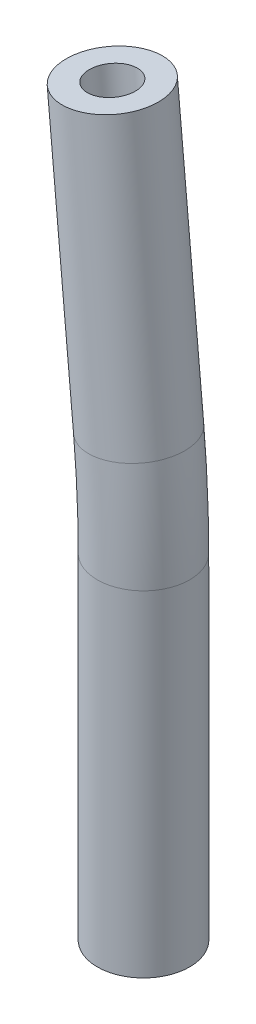
ISO-10303-21;
HEADER;
FILE_DESCRIPTION(('STEP AP214'),'2;1');
FILE_NAME('part.step','',(''),(''),'','','');
FILE_SCHEMA(('AUTOMOTIVE_DESIGN { 1 0 10303 214 1 1 1 1 }'));
ENDSEC;
DATA;
#1=APPLICATION_CONTEXT('core data for automotive mechanical design processes');
#2=APPLICATION_PROTOCOL_DEFINITION('international standard','automotive_design',2000,#1);
#3=PRODUCT_CONTEXT('',#1,'mechanical');
#4=PRODUCT('Part','Part','',(#3));
#5=PRODUCT_RELATED_PRODUCT_CATEGORY('part','',(#4));
#6=PRODUCT_DEFINITION_FORMATION('','',#4);
#7=PRODUCT_DEFINITION_CONTEXT('part definition',#1,'design');
#8=PRODUCT_DEFINITION('design','',#6,#7);
#9=PRODUCT_DEFINITION_SHAPE('','',#8);
#10=(LENGTH_UNIT() NAMED_UNIT(*) SI_UNIT(.MILLI.,.METRE.));
#11=(NAMED_UNIT(*) PLANE_ANGLE_UNIT() SI_UNIT($,.RADIAN.));
#12=(NAMED_UNIT(*) SI_UNIT($,.STERADIAN.) SOLID_ANGLE_UNIT());
#13=UNCERTAINTY_MEASURE_WITH_UNIT(LENGTH_MEASURE(1.E-05),#10,'distance_accuracy_value','');
#14=(GEOMETRIC_REPRESENTATION_CONTEXT(3) GLOBAL_UNCERTAINTY_ASSIGNED_CONTEXT((#13)) GLOBAL_UNIT_ASSIGNED_CONTEXT((#10,
#11,#12)) REPRESENTATION_CONTEXT('',''));
#15=CARTESIAN_POINT('',(0.,0.,0.));
#16=DIRECTION('',(0.,0.,1.));
#17=DIRECTION('',(1.,0.,0.));
#18=AXIS2_PLACEMENT_3D('',#15,#16,#17);
#19=CARTESIAN_POINT('',(0.0518681379725441,-16.7968670346591,0.));
#20=DIRECTION('',(0.,1.,0.));
#21=DIRECTION('',(-1.,0.,0.));
#22=AXIS2_PLACEMENT_3D('',#19,#20,#21);
#23=CYLINDRICAL_SURFACE('',#22,2.);
#24=CARTESIAN_POINT('',(0.0518681379725354,-2.27686703465905,0.));
#25=DIRECTION('',(0.,1.,0.));
#26=DIRECTION('',(0.,0.,1.));
#27=AXIS2_PLACEMENT_3D('',#24,#25,#26);
#28=CIRCLE('',#27,2.);
#29=CARTESIAN_POINT('',(2.05186813797254,-2.27686703465905,0.));
#30=VERTEX_POINT('',#29);
#31=EDGE_CURVE('E58',#30,#30,#28,.T.);
#32=ORIENTED_EDGE('',*,*,#31,.F.);
#33=EDGE_LOOP('',(#32));
#34=FACE_BOUND('',#33,.T.);
#35=CARTESIAN_POINT('',(0.0518681379725441,-16.7968670346591,0.));
#36=DIRECTION('',(0.,1.,0.));
#37=DIRECTION('',(0.,0.,1.));
#38=AXIS2_PLACEMENT_3D('',#35,#36,#37);
#39=CIRCLE('',#38,2.);
#40=CARTESIAN_POINT('',(0.0518681379725441,-16.7968670346591,2.));
#41=VERTEX_POINT('',#40);
#42=EDGE_CURVE('E56',#41,#41,#39,.T.);
#43=ORIENTED_EDGE('',*,*,#42,.T.);
#44=EDGE_LOOP('',(#43));
#45=FACE_BOUND('',#44,.T.);
#46=ADVANCED_FACE('F35',(#34,#45),#23,.T.);
#47=CARTESIAN_POINT('',(-49.9481318620275,-2.27686703465906,0.));
#48=DIRECTION('',(0.,0.,1.));
#49=DIRECTION('',(1.,0.,0.));
#50=AXIS2_PLACEMENT_3D('',#47,#48,#49);
#51=TOROIDAL_SURFACE('',#50,50.,2.);
#52=CARTESIAN_POINT('',(-0.15549680176815,2.27214316051908,0.));
#53=DIRECTION('',(-0.0909802039035622,0.995852701205186,0.));
#54=DIRECTION('',(0.,0.,1.));
#55=AXIS2_PLACEMENT_3D('',#52,#53,#54);
#56=CIRCLE('',#55,2.);
#57=CARTESIAN_POINT('',(1.83620860064224,2.45410356832621,0.));
#58=VERTEX_POINT('',#57);
#59=EDGE_CURVE('E39',#58,#58,#56,.T.);
#60=CARTESIAN_POINT('',(-49.9481318620275,-2.27686703465906,0.));
#61=DIRECTION('',(0.,0.,1.));
#62=DIRECTION('',(1.,0.,0.));
#63=AXIS2_PLACEMENT_3D('',#60,#61,#62);
#64=CIRCLE('',#63,52.);
#65=EDGE_CURVE('',#30,#58,#64,.T.);
#66=ORIENTED_EDGE('',*,*,#31,.T.);
#67=ORIENTED_EDGE('',*,*,#59,.F.);
#68=ORIENTED_EDGE('',*,*,#65,.T.);
#69=ORIENTED_EDGE('',*,*,#65,.F.);
#70=EDGE_LOOP('',(#66,#68,#67,#69));
#71=FACE_BOUND('',#70,.T.);
#72=ADVANCED_FACE('F66',(#71),#51,.T.);
#73=CARTESIAN_POINT('',(-0.155496801768149,2.27214316051909,0.));
#74=DIRECTION('',(-0.0909802039035626,0.995852701205186,0.));
#75=DIRECTION('',(-0.995852701205187,-0.0909802039035626,0.));
#76=AXIS2_PLACEMENT_3D('',#73,#74,#75);
#77=CYLINDRICAL_SURFACE('',#76,2.);
#78=CARTESIAN_POINT('',(-1.2982081627969,14.7800530876562,0.));
#79=DIRECTION('',(-0.090980203903562,0.995852701205186,0.));
#80=DIRECTION('',(0.,0.,1.));
#81=AXIS2_PLACEMENT_3D('',#78,#79,#80);
#82=CIRCLE('',#81,2.);
#83=CARTESIAN_POINT('',(-1.2982081627969,14.7800530876562,2.));
#84=VERTEX_POINT('',#83);
#85=EDGE_CURVE('E52',#84,#84,#82,.T.);
#86=ORIENTED_EDGE('',*,*,#85,.F.);
#87=EDGE_LOOP('',(#86));
#88=FACE_BOUND('',#87,.T.);
#89=ORIENTED_EDGE('',*,*,#59,.T.);
#90=EDGE_LOOP('',(#89));
#91=FACE_BOUND('',#90,.T.);
#92=ADVANCED_FACE('F37',(#88,#91),#77,.T.);
#93=CARTESIAN_POINT('',(0.0518681379725441,-16.7968670346591,0.));
#94=DIRECTION('',(0.,1.,0.));
#95=DIRECTION('',(0.,0.,1.));
#96=AXIS2_PLACEMENT_3D('',#93,#94,#95);
#97=PLANE('',#96);
#98=CARTESIAN_POINT('',(0.0518681379725441,-16.7968670346591,0.));
#99=DIRECTION('',(0.,1.,0.));
#100=DIRECTION('',(0.,0.,1.));
#101=AXIS2_PLACEMENT_3D('',#98,#99,#100);
#102=CIRCLE('',#101,1.);
#103=CARTESIAN_POINT('',(0.0518681379725441,-16.7968670346591,1.));
#104=VERTEX_POINT('',#103);
#105=EDGE_CURVE('E55',#104,#104,#102,.F.);
#106=ORIENTED_EDGE('',*,*,#105,.F.);
#107=EDGE_LOOP('',(#106));
#108=FACE_BOUND('',#107,.T.);
#109=ORIENTED_EDGE('',*,*,#42,.F.);
#110=EDGE_LOOP('',(#109));
#111=FACE_BOUND('',#110,.T.);
#112=ADVANCED_FACE('F72',(#108,#111),#97,.F.);
#113=CARTESIAN_POINT('',(-1.2982081627969,14.7800530876562,0.));
#114=DIRECTION('',(-0.090980203903562,0.995852701205186,0.));
#115=DIRECTION('',(0.,0.,1.));
#116=AXIS2_PLACEMENT_3D('',#113,#114,#115);
#117=PLANE('',#116);
#118=CARTESIAN_POINT('',(-1.2982081627969,14.7800530876562,0.));
#119=DIRECTION('',(-0.090980203903562,0.995852701205186,0.));
#120=DIRECTION('',(0.,0.,1.));
#121=AXIS2_PLACEMENT_3D('',#118,#119,#120);
#122=CIRCLE('',#121,1.);
#123=CARTESIAN_POINT('',(-1.2982081627969,14.7800530876562,1.));
#124=VERTEX_POINT('',#123);
#125=EDGE_CURVE('E10',#124,#124,#122,.F.);
#126=ORIENTED_EDGE('',*,*,#125,.T.);
#127=EDGE_LOOP('',(#126));
#128=FACE_BOUND('',#127,.T.);
#129=ORIENTED_EDGE('',*,*,#85,.T.);
#130=EDGE_LOOP('',(#129));
#131=FACE_BOUND('',#130,.T.);
#132=ADVANCED_FACE('F90',(#128,#131),#117,.T.);
#133=CARTESIAN_POINT('',(0.0518681379725441,-16.7968670346591,0.));
#134=DIRECTION('',(0.,1.,0.));
#135=DIRECTION('',(-1.,0.,0.));
#136=AXIS2_PLACEMENT_3D('',#133,#134,#135);
#137=CYLINDRICAL_SURFACE('',#136,1.);
#138=CARTESIAN_POINT('',(0.0518681379725354,-2.27686703465905,0.));
#139=DIRECTION('',(0.,1.,0.));
#140=DIRECTION('',(0.,0.,1.));
#141=AXIS2_PLACEMENT_3D('',#138,#139,#140);
#142=CIRCLE('',#141,1.);
#143=CARTESIAN_POINT('',(1.05186813797254,-2.27686703465905,0.));
#144=VERTEX_POINT('',#143);
#145=EDGE_CURVE('E48',#144,#144,#142,.F.);
#146=ORIENTED_EDGE('',*,*,#145,.F.);
#147=EDGE_LOOP('',(#146));
#148=FACE_BOUND('',#147,.T.);
#149=ORIENTED_EDGE('',*,*,#105,.T.);
#150=EDGE_LOOP('',(#149));
#151=FACE_BOUND('',#150,.T.);
#152=ADVANCED_FACE('F84',(#148,#151),#137,.F.);
#153=CARTESIAN_POINT('',(-49.9481318620275,-2.27686703465906,0.));
#154=DIRECTION('',(0.,0.,1.));
#155=DIRECTION('',(1.,0.,0.));
#156=AXIS2_PLACEMENT_3D('',#153,#154,#155);
#157=TOROIDAL_SURFACE('',#156,50.,1.);
#158=CARTESIAN_POINT('',(-0.15549680176815,2.27214316051908,0.));
#159=DIRECTION('',(-0.0909802039035622,0.995852701205186,0.));
#160=DIRECTION('',(0.,0.,1.));
#161=AXIS2_PLACEMENT_3D('',#158,#159,#160);
#162=CIRCLE('',#161,1.);
#163=CARTESIAN_POINT('',(0.840355899437047,2.36312336442264,0.));
#164=VERTEX_POINT('',#163);
#165=EDGE_CURVE('E43',#164,#164,#162,.F.);
#166=CARTESIAN_POINT('',(-49.9481318620275,-2.27686703465906,0.));
#167=DIRECTION('',(0.,0.,1.));
#168=DIRECTION('',(1.,0.,0.));
#169=AXIS2_PLACEMENT_3D('',#166,#167,#168);
#170=CIRCLE('',#169,51.);
#171=EDGE_CURVE('',#144,#164,#170,.T.);
#172=ORIENTED_EDGE('',*,*,#145,.T.);
#173=ORIENTED_EDGE('',*,*,#165,.F.);
#174=ORIENTED_EDGE('',*,*,#171,.T.);
#175=ORIENTED_EDGE('',*,*,#171,.F.);
#176=EDGE_LOOP('',(#172,#174,#173,#175));
#177=FACE_BOUND('',#176,.T.);
#178=ADVANCED_FACE('F78',(#177),#157,.F.);
#179=CARTESIAN_POINT('',(-0.155496801768149,2.27214316051909,0.));
#180=DIRECTION('',(-0.0909802039035626,0.995852701205186,0.));
#181=DIRECTION('',(-0.995852701205187,-0.0909802039035626,0.));
#182=AXIS2_PLACEMENT_3D('',#179,#180,#181);
#183=CYLINDRICAL_SURFACE('',#182,1.);
#184=ORIENTED_EDGE('',*,*,#125,.F.);
#185=EDGE_LOOP('',(#184));
#186=FACE_BOUND('',#185,.T.);
#187=ORIENTED_EDGE('',*,*,#165,.T.);
#188=EDGE_LOOP('',(#187));
#189=FACE_BOUND('',#188,.T.);
#190=ADVANCED_FACE('F76',(#186,#189),#183,.F.);
#191=CLOSED_SHELL('',(#46,#72,#92,#112,#132,#152,#178,#190));
#192=MANIFOLD_SOLID_BREP('B2',#191);
#193=ADVANCED_BREP_SHAPE_REPRESENTATION('',(#18,#192),#14);
#194=SHAPE_DEFINITION_REPRESENTATION(#9,#193);
ENDSEC;
END-ISO-10303-21;
